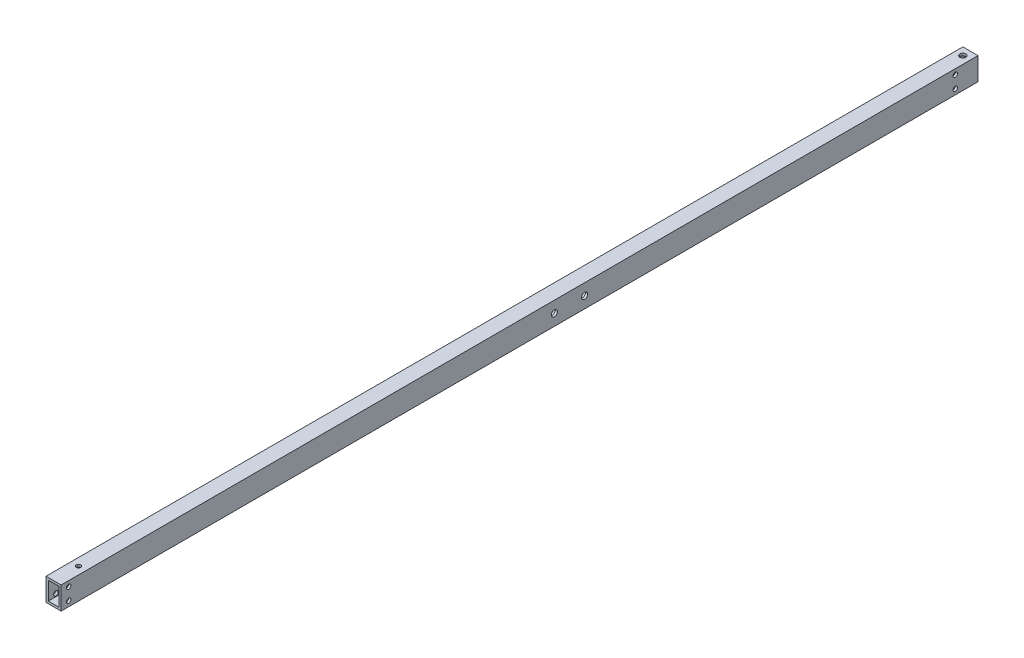
ISO-10303-21;
HEADER;
FILE_DESCRIPTION(('STEP AP214'),'2;1');
FILE_NAME('part.step','',(''),(''),'','','');
FILE_SCHEMA(('AUTOMOTIVE_DESIGN { 1 0 10303 214 1 1 1 1 }'));
ENDSEC;
DATA;
#1=APPLICATION_CONTEXT('core data for automotive mechanical design processes');
#2=APPLICATION_PROTOCOL_DEFINITION('international standard','automotive_design',2000,#1);
#3=PRODUCT_CONTEXT('',#1,'mechanical');
#4=PRODUCT('Part','Part','',(#3));
#5=PRODUCT_RELATED_PRODUCT_CATEGORY('part','',(#4));
#6=PRODUCT_DEFINITION_FORMATION('','',#4);
#7=PRODUCT_DEFINITION_CONTEXT('part definition',#1,'design');
#8=PRODUCT_DEFINITION('design','',#6,#7);
#9=PRODUCT_DEFINITION_SHAPE('','',#8);
#10=(LENGTH_UNIT() NAMED_UNIT(*) SI_UNIT(.MILLI.,.METRE.));
#11=(NAMED_UNIT(*) PLANE_ANGLE_UNIT() SI_UNIT($,.RADIAN.));
#12=(NAMED_UNIT(*) SI_UNIT($,.STERADIAN.) SOLID_ANGLE_UNIT());
#13=UNCERTAINTY_MEASURE_WITH_UNIT(LENGTH_MEASURE(1.E-05),#10,'distance_accuracy_value','');
#14=(GEOMETRIC_REPRESENTATION_CONTEXT(3) GLOBAL_UNCERTAINTY_ASSIGNED_CONTEXT((#13)) GLOBAL_UNIT_ASSIGNED_CONTEXT((#10,
#11,#12)) REPRESENTATION_CONTEXT('',''));
#15=CARTESIAN_POINT('',(0.,0.,0.));
#16=DIRECTION('',(0.,0.,1.));
#17=DIRECTION('',(1.,0.,0.));
#18=AXIS2_PLACEMENT_3D('',#15,#16,#17);
#19=CARTESIAN_POINT('',(0.,0.,606.));
#20=DIRECTION('',(0.,0.,1.));
#21=DIRECTION('',(1.,0.,0.));
#22=AXIS2_PLACEMENT_3D('',#19,#20,#21);
#23=PLANE('',#22);
#24=DIRECTION('',(0.,1.,0.));
#25=VECTOR('',#24,1.);
#26=CARTESIAN_POINT('',(5.,-7.5,606.));
#27=LINE('',#26,#25);
#28=CARTESIAN_POINT('',(5.,-7.5,606.));
#29=VERTEX_POINT('',#28);
#30=CARTESIAN_POINT('',(5.,7.5,606.));
#31=VERTEX_POINT('',#30);
#32=EDGE_CURVE('E164',#29,#31,#27,.T.);
#33=ORIENTED_EDGE('',*,*,#32,.T.);
#34=DIRECTION('',(-1.,0.,0.));
#35=VECTOR('',#34,1.);
#36=CARTESIAN_POINT('',(-5.,7.5,606.));
#37=LINE('',#36,#35);
#38=CARTESIAN_POINT('',(-5.,7.5,606.));
#39=VERTEX_POINT('',#38);
#40=EDGE_CURVE('E167',#31,#39,#37,.T.);
#41=ORIENTED_EDGE('',*,*,#40,.T.);
#42=DIRECTION('',(0.,-1.,0.));
#43=VECTOR('',#42,1.);
#44=CARTESIAN_POINT('',(-5.,-7.5,606.));
#45=LINE('',#44,#43);
#46=CARTESIAN_POINT('',(-5.,-7.5,606.));
#47=VERTEX_POINT('',#46);
#48=EDGE_CURVE('E170',#39,#47,#45,.T.);
#49=ORIENTED_EDGE('',*,*,#48,.T.);
#50=DIRECTION('',(1.,0.,0.));
#51=VECTOR('',#50,1.);
#52=CARTESIAN_POINT('',(-5.,-7.5,606.));
#53=LINE('',#52,#51);
#54=EDGE_CURVE('E172',#47,#29,#53,.T.);
#55=ORIENTED_EDGE('',*,*,#54,.T.);
#56=EDGE_LOOP('',(#33,#41,#49,#55));
#57=FACE_BOUND('',#56,.T.);
#58=DIRECTION('',(-1.,0.,0.));
#59=VECTOR('',#58,1.);
#60=CARTESIAN_POINT('',(0.,6.,606.));
#61=LINE('',#60,#59);
#62=CARTESIAN_POINT('',(3.5,6.,606.));
#63=VERTEX_POINT('',#62);
#64=CARTESIAN_POINT('',(-3.5,6.,606.));
#65=VERTEX_POINT('',#64);
#66=EDGE_CURVE('E134',#63,#65,#61,.T.);
#67=ORIENTED_EDGE('',*,*,#66,.F.);
#68=DIRECTION('',(0.,1.,0.));
#69=VECTOR('',#68,1.);
#70=CARTESIAN_POINT('',(3.5,0.,606.));
#71=LINE('',#70,#69);
#72=CARTESIAN_POINT('',(3.5,-6.,606.));
#73=VERTEX_POINT('',#72);
#74=EDGE_CURVE('E126',#73,#63,#71,.T.);
#75=ORIENTED_EDGE('',*,*,#74,.F.);
#76=DIRECTION('',(1.,0.,0.));
#77=VECTOR('',#76,1.);
#78=CARTESIAN_POINT('',(0.,-6.,606.));
#79=LINE('',#78,#77);
#80=CARTESIAN_POINT('',(-3.5,-6.,606.));
#81=VERTEX_POINT('',#80);
#82=EDGE_CURVE('E148',#81,#73,#79,.T.);
#83=ORIENTED_EDGE('',*,*,#82,.F.);
#84=DIRECTION('',(0.,-1.,0.));
#85=VECTOR('',#84,1.);
#86=CARTESIAN_POINT('',(-3.5,0.,606.));
#87=LINE('',#86,#85);
#88=EDGE_CURVE('E146',#65,#81,#87,.T.);
#89=ORIENTED_EDGE('',*,*,#88,.F.);
#90=EDGE_LOOP('',(#67,#75,#83,#89));
#91=FACE_BOUND('',#90,.T.);
#92=ADVANCED_FACE('F59',(#57,#91),#23,.T.);
#93=CARTESIAN_POINT('',(0.,0.,0.));
#94=DIRECTION('',(0.,0.,1.));
#95=DIRECTION('',(1.,0.,0.));
#96=AXIS2_PLACEMENT_3D('',#93,#94,#95);
#97=PLANE('',#96);
#98=DIRECTION('',(0.,1.,0.));
#99=VECTOR('',#98,1.);
#100=CARTESIAN_POINT('',(5.,-7.5,0.));
#101=LINE('',#100,#99);
#102=CARTESIAN_POINT('',(5.,-7.5,0.));
#103=VERTEX_POINT('',#102);
#104=CARTESIAN_POINT('',(5.,7.5,0.));
#105=VERTEX_POINT('',#104);
#106=EDGE_CURVE('E142',#103,#105,#101,.T.);
#107=ORIENTED_EDGE('',*,*,#106,.F.);
#108=DIRECTION('',(1.,0.,0.));
#109=VECTOR('',#108,1.);
#110=CARTESIAN_POINT('',(-5.,-7.5,0.));
#111=LINE('',#110,#109);
#112=CARTESIAN_POINT('',(-5.,-7.5,0.));
#113=VERTEX_POINT('',#112);
#114=EDGE_CURVE('E168',#113,#103,#111,.T.);
#115=ORIENTED_EDGE('',*,*,#114,.F.);
#116=DIRECTION('',(0.,-1.,0.));
#117=VECTOR('',#116,1.);
#118=CARTESIAN_POINT('',(-5.,-7.5,0.));
#119=LINE('',#118,#117);
#120=CARTESIAN_POINT('',(-5.,7.5,0.));
#121=VERTEX_POINT('',#120);
#122=EDGE_CURVE('E179',#121,#113,#119,.T.);
#123=ORIENTED_EDGE('',*,*,#122,.F.);
#124=DIRECTION('',(-1.,0.,0.));
#125=VECTOR('',#124,1.);
#126=CARTESIAN_POINT('',(-5.,7.5,0.));
#127=LINE('',#126,#125);
#128=EDGE_CURVE('E177',#105,#121,#127,.T.);
#129=ORIENTED_EDGE('',*,*,#128,.F.);
#130=EDGE_LOOP('',(#107,#115,#123,#129));
#131=FACE_BOUND('',#130,.T.);
#132=DIRECTION('',(0.,1.,0.));
#133=VECTOR('',#132,1.);
#134=CARTESIAN_POINT('',(3.5,0.,0.));
#135=LINE('',#134,#133);
#136=CARTESIAN_POINT('',(3.5,-6.,0.));
#137=VERTEX_POINT('',#136);
#138=CARTESIAN_POINT('',(3.5,6.,0.));
#139=VERTEX_POINT('',#138);
#140=EDGE_CURVE('E84',#137,#139,#135,.T.);
#141=ORIENTED_EDGE('',*,*,#140,.T.);
#142=DIRECTION('',(-1.,0.,0.));
#143=VECTOR('',#142,1.);
#144=CARTESIAN_POINT('',(0.,6.,0.));
#145=LINE('',#144,#143);
#146=CARTESIAN_POINT('',(-3.5,6.,0.));
#147=VERTEX_POINT('',#146);
#148=EDGE_CURVE('E141',#139,#147,#145,.T.);
#149=ORIENTED_EDGE('',*,*,#148,.T.);
#150=DIRECTION('',(0.,-1.,0.));
#151=VECTOR('',#150,1.);
#152=CARTESIAN_POINT('',(-3.5,0.,0.));
#153=LINE('',#152,#151);
#154=CARTESIAN_POINT('',(-3.5,-6.,0.));
#155=VERTEX_POINT('',#154);
#156=EDGE_CURVE('E156',#147,#155,#153,.T.);
#157=ORIENTED_EDGE('',*,*,#156,.T.);
#158=DIRECTION('',(1.,0.,0.));
#159=VECTOR('',#158,1.);
#160=CARTESIAN_POINT('',(0.,-6.,0.));
#161=LINE('',#160,#159);
#162=EDGE_CURVE('E135',#155,#137,#161,.T.);
#163=ORIENTED_EDGE('',*,*,#162,.T.);
#164=EDGE_LOOP('',(#141,#149,#157,#163));
#165=FACE_BOUND('',#164,.T.);
#166=ADVANCED_FACE('F313',(#131,#165),#97,.F.);
#167=CARTESIAN_POINT('',(5.,-7.5,606.));
#168=DIRECTION('',(-1.,0.,0.));
#169=DIRECTION('',(0.,0.,1.));
#170=AXIS2_PLACEMENT_3D('',#167,#168,#169);
#171=PLANE('',#170);
#172=CARTESIAN_POINT('',(5.,4.,15.));
#173=DIRECTION('',(1.,0.,0.));
#174=DIRECTION('',(0.,0.,-1.));
#175=AXIS2_PLACEMENT_3D('',#172,#173,#174);
#176=CIRCLE('',#175,1.5);
#177=CARTESIAN_POINT('',(5.,4.,13.5));
#178=VERTEX_POINT('',#177);
#179=EDGE_CURVE('E248',#178,#178,#176,.T.);
#180=ORIENTED_EDGE('',*,*,#179,.F.);
#181=EDGE_LOOP('',(#180));
#182=FACE_BOUND('',#181,.T.);
#183=CARTESIAN_POINT('',(5.,-4.,15.));
#184=DIRECTION('',(1.,0.,0.));
#185=DIRECTION('',(0.,0.,1.));
#186=AXIS2_PLACEMENT_3D('',#183,#184,#185);
#187=CIRCLE('',#186,1.5);
#188=CARTESIAN_POINT('',(5.,-4.,16.5));
#189=VERTEX_POINT('',#188);
#190=EDGE_CURVE('E254',#189,#189,#187,.T.);
#191=ORIENTED_EDGE('',*,*,#190,.F.);
#192=EDGE_LOOP('',(#191));
#193=FACE_BOUND('',#192,.T.);
#194=CARTESIAN_POINT('',(5.,0.,280.));
#195=DIRECTION('',(1.,0.,0.));
#196=DIRECTION('',(0.,0.,-1.));
#197=AXIS2_PLACEMENT_3D('',#194,#195,#196);
#198=CIRCLE('',#197,2.);
#199=CARTESIAN_POINT('',(5.,0.,278.));
#200=VERTEX_POINT('',#199);
#201=EDGE_CURVE('E260',#200,#200,#198,.T.);
#202=ORIENTED_EDGE('',*,*,#201,.F.);
#203=EDGE_LOOP('',(#202));
#204=FACE_BOUND('',#203,.T.);
#205=CARTESIAN_POINT('',(5.,-4.,601.));
#206=DIRECTION('',(1.,0.,0.));
#207=DIRECTION('',(0.,0.,1.));
#208=AXIS2_PLACEMENT_3D('',#205,#206,#207);
#209=CIRCLE('',#208,1.49999999999997);
#210=CARTESIAN_POINT('',(5.,-4.,602.5));
#211=VERTEX_POINT('',#210);
#212=EDGE_CURVE('E241',#211,#211,#209,.T.);
#213=ORIENTED_EDGE('',*,*,#212,.F.);
#214=EDGE_LOOP('',(#213));
#215=FACE_BOUND('',#214,.T.);
#216=CARTESIAN_POINT('',(5.,0.,260.));
#217=DIRECTION('',(1.,0.,0.));
#218=DIRECTION('',(0.,0.,-1.));
#219=AXIS2_PLACEMENT_3D('',#216,#217,#218);
#220=CIRCLE('',#219,2.);
#221=CARTESIAN_POINT('',(5.,0.,258.));
#222=VERTEX_POINT('',#221);
#223=EDGE_CURVE('E237',#222,#222,#220,.T.);
#224=ORIENTED_EDGE('',*,*,#223,.F.);
#225=EDGE_LOOP('',(#224));
#226=FACE_BOUND('',#225,.T.);
#227=CARTESIAN_POINT('',(5.,4.,601.));
#228=DIRECTION('',(1.,0.,0.));
#229=DIRECTION('',(0.,0.,-1.));
#230=AXIS2_PLACEMENT_3D('',#227,#228,#229);
#231=CIRCLE('',#230,1.49999999999997);
#232=CARTESIAN_POINT('',(5.,4.,599.5));
#233=VERTEX_POINT('',#232);
#234=EDGE_CURVE('E247',#233,#233,#231,.T.);
#235=ORIENTED_EDGE('',*,*,#234,.F.);
#236=EDGE_LOOP('',(#235));
#237=FACE_BOUND('',#236,.T.);
#238=ORIENTED_EDGE('',*,*,#106,.T.);
#239=DIRECTION('',(0.,0.,-1.));
#240=VECTOR('',#239,1.);
#241=CARTESIAN_POINT('',(5.,7.5,606.));
#242=LINE('',#241,#240);
#243=EDGE_CURVE('E12',#31,#105,#242,.T.);
#244=ORIENTED_EDGE('',*,*,#243,.F.);
#245=ORIENTED_EDGE('',*,*,#32,.F.);
#246=DIRECTION('',(0.,0.,-1.));
#247=VECTOR('',#246,1.);
#248=CARTESIAN_POINT('',(5.,-7.5,606.));
#249=LINE('',#248,#247);
#250=EDGE_CURVE('E174',#29,#103,#249,.T.);
#251=ORIENTED_EDGE('',*,*,#250,.T.);
#252=EDGE_LOOP('',(#238,#244,#245,#251));
#253=FACE_BOUND('',#252,.T.);
#254=ADVANCED_FACE('F61',(#182,#193,#204,#215,#226,#237,#253),#171,.F.);
#255=CARTESIAN_POINT('',(-5.,7.5,606.));
#256=DIRECTION('',(0.,-1.,0.));
#257=DIRECTION('',(0.,0.,-1.));
#258=AXIS2_PLACEMENT_3D('',#255,#256,#257);
#259=PLANE('',#258);
#260=CARTESIAN_POINT('',(0.,7.5,5.));
#261=DIRECTION('',(0.,1.,0.));
#262=DIRECTION('',(0.,0.,1.));
#263=AXIS2_PLACEMENT_3D('',#260,#261,#262);
#264=CIRCLE('',#263,2.);
#265=CARTESIAN_POINT('',(0.,7.5,7.));
#266=VERTEX_POINT('',#265);
#267=EDGE_CURVE('E221',#266,#266,#264,.T.);
#268=ORIENTED_EDGE('',*,*,#267,.F.);
#269=EDGE_LOOP('',(#268));
#270=FACE_BOUND('',#269,.T.);
#271=CARTESIAN_POINT('',(0.,7.5,589.5));
#272=DIRECTION('',(0.,1.,0.));
#273=DIRECTION('',(0.,0.,1.));
#274=AXIS2_PLACEMENT_3D('',#271,#272,#273);
#275=CIRCLE('',#274,1.5);
#276=CARTESIAN_POINT('',(0.,7.5,591.));
#277=VERTEX_POINT('',#276);
#278=EDGE_CURVE('E231',#277,#277,#275,.T.);
#279=ORIENTED_EDGE('',*,*,#278,.F.);
#280=EDGE_LOOP('',(#279));
#281=FACE_BOUND('',#280,.T.);
#282=ORIENTED_EDGE('',*,*,#128,.T.);
#283=DIRECTION('',(0.,0.,-1.));
#284=VECTOR('',#283,1.);
#285=CARTESIAN_POINT('',(-5.,7.5,606.));
#286=LINE('',#285,#284);
#287=EDGE_CURVE('E68',#39,#121,#286,.T.);
#288=ORIENTED_EDGE('',*,*,#287,.F.);
#289=ORIENTED_EDGE('',*,*,#40,.F.);
#290=ORIENTED_EDGE('',*,*,#243,.T.);
#291=EDGE_LOOP('',(#282,#288,#289,#290));
#292=FACE_BOUND('',#291,.T.);
#293=ADVANCED_FACE('F312',(#270,#281,#292),#259,.F.);
#294=CARTESIAN_POINT('',(-5.,-7.5,606.));
#295=DIRECTION('',(1.,0.,0.));
#296=DIRECTION('',(0.,0.,-1.));
#297=AXIS2_PLACEMENT_3D('',#294,#295,#296);
#298=PLANE('',#297);
#299=CARTESIAN_POINT('',(-5.,4.,15.));
#300=DIRECTION('',(1.,0.,0.));
#301=DIRECTION('',(0.,0.,-1.));
#302=AXIS2_PLACEMENT_3D('',#299,#300,#301);
#303=CIRCLE('',#302,1.5);
#304=CARTESIAN_POINT('',(-5.,4.,13.5));
#305=VERTEX_POINT('',#304);
#306=EDGE_CURVE('E244',#305,#305,#303,.T.);
#307=ORIENTED_EDGE('',*,*,#306,.T.);
#308=EDGE_LOOP('',(#307));
#309=FACE_BOUND('',#308,.T.);
#310=CARTESIAN_POINT('',(-5.,-4.,15.));
#311=DIRECTION('',(1.,0.,0.));
#312=DIRECTION('',(0.,0.,1.));
#313=AXIS2_PLACEMENT_3D('',#310,#311,#312);
#314=CIRCLE('',#313,1.5);
#315=CARTESIAN_POINT('',(-5.,-4.,16.5));
#316=VERTEX_POINT('',#315);
#317=EDGE_CURVE('E251',#316,#316,#314,.T.);
#318=ORIENTED_EDGE('',*,*,#317,.T.);
#319=EDGE_LOOP('',(#318));
#320=FACE_BOUND('',#319,.T.);
#321=CARTESIAN_POINT('',(-5.,0.,280.));
#322=DIRECTION('',(1.,0.,0.));
#323=DIRECTION('',(0.,0.,-1.));
#324=AXIS2_PLACEMENT_3D('',#321,#322,#323);
#325=CIRCLE('',#324,2.);
#326=CARTESIAN_POINT('',(-5.,0.,278.));
#327=VERTEX_POINT('',#326);
#328=EDGE_CURVE('E257',#327,#327,#325,.T.);
#329=ORIENTED_EDGE('',*,*,#328,.T.);
#330=EDGE_LOOP('',(#329));
#331=FACE_BOUND('',#330,.T.);
#332=CARTESIAN_POINT('',(-5.,-4.,601.));
#333=DIRECTION('',(1.,0.,0.));
#334=DIRECTION('',(0.,0.,1.));
#335=AXIS2_PLACEMENT_3D('',#332,#333,#334);
#336=CIRCLE('',#335,1.49999999999997);
#337=CARTESIAN_POINT('',(-5.,-4.,602.5));
#338=VERTEX_POINT('',#337);
#339=EDGE_CURVE('E263',#338,#338,#336,.T.);
#340=ORIENTED_EDGE('',*,*,#339,.T.);
#341=EDGE_LOOP('',(#340));
#342=FACE_BOUND('',#341,.T.);
#343=CARTESIAN_POINT('',(-5.,0.,260.));
#344=DIRECTION('',(1.,0.,0.));
#345=DIRECTION('',(0.,0.,-1.));
#346=AXIS2_PLACEMENT_3D('',#343,#344,#345);
#347=CIRCLE('',#346,2.);
#348=CARTESIAN_POINT('',(-5.,0.,258.));
#349=VERTEX_POINT('',#348);
#350=EDGE_CURVE('E238',#349,#349,#347,.T.);
#351=ORIENTED_EDGE('',*,*,#350,.T.);
#352=EDGE_LOOP('',(#351));
#353=FACE_BOUND('',#352,.T.);
#354=CARTESIAN_POINT('',(-5.,4.,601.));
#355=DIRECTION('',(1.,0.,0.));
#356=DIRECTION('',(0.,0.,-1.));
#357=AXIS2_PLACEMENT_3D('',#354,#355,#356);
#358=CIRCLE('',#357,1.49999999999997);
#359=CARTESIAN_POINT('',(-5.,4.,599.5));
#360=VERTEX_POINT('',#359);
#361=EDGE_CURVE('E193',#360,#360,#358,.T.);
#362=ORIENTED_EDGE('',*,*,#361,.T.);
#363=EDGE_LOOP('',(#362));
#364=FACE_BOUND('',#363,.T.);
#365=ORIENTED_EDGE('',*,*,#122,.T.);
#366=DIRECTION('',(0.,0.,-1.));
#367=VECTOR('',#366,1.);
#368=CARTESIAN_POINT('',(-5.,-7.5,606.));
#369=LINE('',#368,#367);
#370=EDGE_CURVE('E184',#47,#113,#369,.T.);
#371=ORIENTED_EDGE('',*,*,#370,.F.);
#372=ORIENTED_EDGE('',*,*,#48,.F.);
#373=ORIENTED_EDGE('',*,*,#287,.T.);
#374=EDGE_LOOP('',(#365,#371,#372,#373));
#375=FACE_BOUND('',#374,.T.);
#376=ADVANCED_FACE('F331',(#309,#320,#331,#342,#353,#364,#375),#298,.F.);
#377=CARTESIAN_POINT('',(-5.,-7.5,606.));
#378=DIRECTION('',(0.,1.,0.));
#379=DIRECTION('',(0.,0.,1.));
#380=AXIS2_PLACEMENT_3D('',#377,#378,#379);
#381=PLANE('',#380);
#382=CARTESIAN_POINT('',(0.,-7.5,5.));
#383=DIRECTION('',(0.,1.,0.));
#384=DIRECTION('',(0.,0.,1.));
#385=AXIS2_PLACEMENT_3D('',#382,#383,#384);
#386=CIRCLE('',#385,2.);
#387=CARTESIAN_POINT('',(0.,-7.5,7.));
#388=VERTEX_POINT('',#387);
#389=EDGE_CURVE('E215',#388,#388,#386,.T.);
#390=ORIENTED_EDGE('',*,*,#389,.T.);
#391=EDGE_LOOP('',(#390));
#392=FACE_BOUND('',#391,.T.);
#393=CARTESIAN_POINT('',(0.,-7.5,589.5));
#394=DIRECTION('',(0.,1.,0.));
#395=DIRECTION('',(0.,0.,1.));
#396=AXIS2_PLACEMENT_3D('',#393,#394,#395);
#397=CIRCLE('',#396,1.5);
#398=CARTESIAN_POINT('',(0.,-7.5,591.));
#399=VERTEX_POINT('',#398);
#400=EDGE_CURVE('E226',#399,#399,#397,.T.);
#401=ORIENTED_EDGE('',*,*,#400,.T.);
#402=EDGE_LOOP('',(#401));
#403=FACE_BOUND('',#402,.T.);
#404=ORIENTED_EDGE('',*,*,#114,.T.);
#405=ORIENTED_EDGE('',*,*,#250,.F.);
#406=ORIENTED_EDGE('',*,*,#54,.F.);
#407=ORIENTED_EDGE('',*,*,#370,.T.);
#408=EDGE_LOOP('',(#404,#405,#406,#407));
#409=FACE_BOUND('',#408,.T.);
#410=ADVANCED_FACE('F289',(#392,#403,#409),#381,.F.);
#411=CARTESIAN_POINT('',(3.5,0.,606.));
#412=DIRECTION('',(-1.,0.,0.));
#413=DIRECTION('',(0.,0.,1.));
#414=AXIS2_PLACEMENT_3D('',#411,#412,#413);
#415=PLANE('',#414);
#416=CARTESIAN_POINT('',(3.5,4.,15.));
#417=DIRECTION('',(-1.,0.,0.));
#418=DIRECTION('',(0.,0.,1.));
#419=AXIS2_PLACEMENT_3D('',#416,#417,#418);
#420=CIRCLE('',#419,1.5);
#421=CARTESIAN_POINT('',(3.5,4.,16.5));
#422=VERTEX_POINT('',#421);
#423=EDGE_CURVE('E154',#422,#422,#420,.T.);
#424=ORIENTED_EDGE('',*,*,#423,.F.);
#425=EDGE_LOOP('',(#424));
#426=FACE_BOUND('',#425,.T.);
#427=CARTESIAN_POINT('',(3.5,-4.,15.));
#428=DIRECTION('',(-1.,0.,0.));
#429=DIRECTION('',(0.,0.,1.));
#430=AXIS2_PLACEMENT_3D('',#427,#428,#429);
#431=CIRCLE('',#430,1.5);
#432=CARTESIAN_POINT('',(3.5,-4.,16.5));
#433=VERTEX_POINT('',#432);
#434=EDGE_CURVE('E209',#433,#433,#431,.T.);
#435=ORIENTED_EDGE('',*,*,#434,.F.);
#436=EDGE_LOOP('',(#435));
#437=FACE_BOUND('',#436,.T.);
#438=CARTESIAN_POINT('',(3.5,0.,280.));
#439=DIRECTION('',(-1.,0.,0.));
#440=DIRECTION('',(0.,0.,1.));
#441=AXIS2_PLACEMENT_3D('',#438,#439,#440);
#442=CIRCLE('',#441,2.);
#443=CARTESIAN_POINT('',(3.5,0.,282.));
#444=VERTEX_POINT('',#443);
#445=EDGE_CURVE('E205',#444,#444,#442,.T.);
#446=ORIENTED_EDGE('',*,*,#445,.F.);
#447=EDGE_LOOP('',(#446));
#448=FACE_BOUND('',#447,.T.);
#449=CARTESIAN_POINT('',(3.5,-4.,601.));
#450=DIRECTION('',(-1.,0.,0.));
#451=DIRECTION('',(0.,0.,1.));
#452=AXIS2_PLACEMENT_3D('',#449,#450,#451);
#453=CIRCLE('',#452,1.49999999999997);
#454=CARTESIAN_POINT('',(3.5,-4.,602.5));
#455=VERTEX_POINT('',#454);
#456=EDGE_CURVE('E201',#455,#455,#453,.T.);
#457=ORIENTED_EDGE('',*,*,#456,.F.);
#458=EDGE_LOOP('',(#457));
#459=FACE_BOUND('',#458,.T.);
#460=CARTESIAN_POINT('',(3.5,0.,260.));
#461=DIRECTION('',(-1.,0.,0.));
#462=DIRECTION('',(0.,0.,1.));
#463=AXIS2_PLACEMENT_3D('',#460,#461,#462);
#464=CIRCLE('',#463,2.);
#465=CARTESIAN_POINT('',(3.5,0.,262.));
#466=VERTEX_POINT('',#465);
#467=EDGE_CURVE('E197',#466,#466,#464,.T.);
#468=ORIENTED_EDGE('',*,*,#467,.F.);
#469=EDGE_LOOP('',(#468));
#470=FACE_BOUND('',#469,.T.);
#471=CARTESIAN_POINT('',(3.5,4.,601.));
#472=DIRECTION('',(-1.,0.,0.));
#473=DIRECTION('',(0.,0.,1.));
#474=AXIS2_PLACEMENT_3D('',#471,#472,#473);
#475=CIRCLE('',#474,1.49999999999997);
#476=CARTESIAN_POINT('',(3.5,4.,602.5));
#477=VERTEX_POINT('',#476);
#478=EDGE_CURVE('E192',#477,#477,#475,.T.);
#479=ORIENTED_EDGE('',*,*,#478,.F.);
#480=EDGE_LOOP('',(#479));
#481=FACE_BOUND('',#480,.T.);
#482=ORIENTED_EDGE('',*,*,#140,.F.);
#483=DIRECTION('',(0.,0.,-1.));
#484=VECTOR('',#483,1.);
#485=CARTESIAN_POINT('',(3.5,-6.,606.));
#486=LINE('',#485,#484);
#487=EDGE_CURVE('E130',#73,#137,#486,.T.);
#488=ORIENTED_EDGE('',*,*,#487,.F.);
#489=ORIENTED_EDGE('',*,*,#74,.T.);
#490=DIRECTION('',(0.,0.,-1.));
#491=VECTOR('',#490,1.);
#492=CARTESIAN_POINT('',(3.5,6.,606.));
#493=LINE('',#492,#491);
#494=EDGE_CURVE('E129',#63,#139,#493,.T.);
#495=ORIENTED_EDGE('',*,*,#494,.T.);
#496=EDGE_LOOP('',(#482,#488,#489,#495));
#497=FACE_BOUND('',#496,.T.);
#498=ADVANCED_FACE('F128',(#426,#437,#448,#459,#470,#481,#497),#415,.T.);
#499=CARTESIAN_POINT('',(0.,6.,606.));
#500=DIRECTION('',(0.,-1.,0.));
#501=DIRECTION('',(0.,0.,-1.));
#502=AXIS2_PLACEMENT_3D('',#499,#500,#501);
#503=PLANE('',#502);
#504=CARTESIAN_POINT('',(0.,6.,5.));
#505=DIRECTION('',(0.,-1.,0.));
#506=DIRECTION('',(0.,0.,-1.));
#507=AXIS2_PLACEMENT_3D('',#504,#505,#506);
#508=CIRCLE('',#507,2.);
#509=CARTESIAN_POINT('',(0.,6.,3.));
#510=VERTEX_POINT('',#509);
#511=EDGE_CURVE('E234',#510,#510,#508,.T.);
#512=ORIENTED_EDGE('',*,*,#511,.F.);
#513=EDGE_LOOP('',(#512));
#514=FACE_BOUND('',#513,.T.);
#515=CARTESIAN_POINT('',(0.,6.,589.5));
#516=DIRECTION('',(0.,-1.,0.));
#517=DIRECTION('',(0.,0.,-1.));
#518=AXIS2_PLACEMENT_3D('',#515,#516,#517);
#519=CIRCLE('',#518,1.5);
#520=CARTESIAN_POINT('',(0.,6.,588.));
#521=VERTEX_POINT('',#520);
#522=EDGE_CURVE('E214',#521,#521,#519,.T.);
#523=ORIENTED_EDGE('',*,*,#522,.F.);
#524=EDGE_LOOP('',(#523));
#525=FACE_BOUND('',#524,.T.);
#526=ORIENTED_EDGE('',*,*,#148,.F.);
#527=ORIENTED_EDGE('',*,*,#494,.F.);
#528=ORIENTED_EDGE('',*,*,#66,.T.);
#529=DIRECTION('',(0.,0.,-1.));
#530=VECTOR('',#529,1.);
#531=CARTESIAN_POINT('',(-3.5,6.,606.));
#532=LINE('',#531,#530);
#533=EDGE_CURVE('E143',#65,#147,#532,.T.);
#534=ORIENTED_EDGE('',*,*,#533,.T.);
#535=EDGE_LOOP('',(#526,#527,#528,#534));
#536=FACE_BOUND('',#535,.T.);
#537=ADVANCED_FACE('F138',(#514,#525,#536),#503,.T.);
#538=CARTESIAN_POINT('',(-3.5,0.,606.));
#539=DIRECTION('',(1.,0.,0.));
#540=DIRECTION('',(0.,0.,-1.));
#541=AXIS2_PLACEMENT_3D('',#538,#539,#540);
#542=PLANE('',#541);
#543=CARTESIAN_POINT('',(-3.5,4.,15.));
#544=DIRECTION('',(1.,0.,0.));
#545=DIRECTION('',(0.,0.,-1.));
#546=AXIS2_PLACEMENT_3D('',#543,#544,#545);
#547=CIRCLE('',#546,1.5);
#548=CARTESIAN_POINT('',(-3.5,4.,13.5));
#549=VERTEX_POINT('',#548);
#550=EDGE_CURVE('E210',#549,#549,#547,.T.);
#551=ORIENTED_EDGE('',*,*,#550,.F.);
#552=EDGE_LOOP('',(#551));
#553=FACE_BOUND('',#552,.T.);
#554=CARTESIAN_POINT('',(-3.5,-4.,15.));
#555=DIRECTION('',(1.,0.,0.));
#556=DIRECTION('',(0.,0.,-1.));
#557=AXIS2_PLACEMENT_3D('',#554,#555,#556);
#558=CIRCLE('',#557,1.5);
#559=CARTESIAN_POINT('',(-3.5,-4.,13.5));
#560=VERTEX_POINT('',#559);
#561=EDGE_CURVE('E206',#560,#560,#558,.T.);
#562=ORIENTED_EDGE('',*,*,#561,.F.);
#563=EDGE_LOOP('',(#562));
#564=FACE_BOUND('',#563,.T.);
#565=CARTESIAN_POINT('',(-3.5,0.,280.));
#566=DIRECTION('',(1.,0.,0.));
#567=DIRECTION('',(0.,0.,-1.));
#568=AXIS2_PLACEMENT_3D('',#565,#566,#567);
#569=CIRCLE('',#568,2.);
#570=CARTESIAN_POINT('',(-3.5,0.,278.));
#571=VERTEX_POINT('',#570);
#572=EDGE_CURVE('E202',#571,#571,#569,.T.);
#573=ORIENTED_EDGE('',*,*,#572,.F.);
#574=EDGE_LOOP('',(#573));
#575=FACE_BOUND('',#574,.T.);
#576=CARTESIAN_POINT('',(-3.5,-4.,601.));
#577=DIRECTION('',(1.,0.,0.));
#578=DIRECTION('',(0.,0.,-1.));
#579=AXIS2_PLACEMENT_3D('',#576,#577,#578);
#580=CIRCLE('',#579,1.49999999999997);
#581=CARTESIAN_POINT('',(-3.5,-4.,599.5));
#582=VERTEX_POINT('',#581);
#583=EDGE_CURVE('E198',#582,#582,#580,.T.);
#584=ORIENTED_EDGE('',*,*,#583,.F.);
#585=EDGE_LOOP('',(#584));
#586=FACE_BOUND('',#585,.T.);
#587=CARTESIAN_POINT('',(-3.5,0.,260.));
#588=DIRECTION('',(1.,0.,0.));
#589=DIRECTION('',(0.,0.,-1.));
#590=AXIS2_PLACEMENT_3D('',#587,#588,#589);
#591=CIRCLE('',#590,2.);
#592=CARTESIAN_POINT('',(-3.5,0.,258.));
#593=VERTEX_POINT('',#592);
#594=EDGE_CURVE('E194',#593,#593,#591,.T.);
#595=ORIENTED_EDGE('',*,*,#594,.F.);
#596=EDGE_LOOP('',(#595));
#597=FACE_BOUND('',#596,.T.);
#598=CARTESIAN_POINT('',(-3.5,4.,601.));
#599=DIRECTION('',(1.,0.,0.));
#600=DIRECTION('',(0.,0.,-1.));
#601=AXIS2_PLACEMENT_3D('',#598,#599,#600);
#602=CIRCLE('',#601,1.49999999999997);
#603=CARTESIAN_POINT('',(-3.5,4.,599.5));
#604=VERTEX_POINT('',#603);
#605=EDGE_CURVE('E189',#604,#604,#602,.T.);
#606=ORIENTED_EDGE('',*,*,#605,.F.);
#607=EDGE_LOOP('',(#606));
#608=FACE_BOUND('',#607,.T.);
#609=ORIENTED_EDGE('',*,*,#156,.F.);
#610=ORIENTED_EDGE('',*,*,#533,.F.);
#611=ORIENTED_EDGE('',*,*,#88,.T.);
#612=DIRECTION('',(0.,0.,-1.));
#613=VECTOR('',#612,1.);
#614=CARTESIAN_POINT('',(-3.5,-6.,606.));
#615=LINE('',#614,#613);
#616=EDGE_CURVE('E76',#81,#155,#615,.T.);
#617=ORIENTED_EDGE('',*,*,#616,.T.);
#618=EDGE_LOOP('',(#609,#610,#611,#617));
#619=FACE_BOUND('',#618,.T.);
#620=ADVANCED_FACE('F351',(#553,#564,#575,#586,#597,#608,#619),#542,.T.);
#621=CARTESIAN_POINT('',(0.,-6.,606.));
#622=DIRECTION('',(0.,1.,0.));
#623=DIRECTION('',(0.,0.,1.));
#624=AXIS2_PLACEMENT_3D('',#621,#622,#623);
#625=PLANE('',#624);
#626=CARTESIAN_POINT('',(0.,-6.,5.));
#627=DIRECTION('',(0.,1.,0.));
#628=DIRECTION('',(0.,0.,1.));
#629=AXIS2_PLACEMENT_3D('',#626,#627,#628);
#630=CIRCLE('',#629,2.);
#631=CARTESIAN_POINT('',(0.,-6.,7.));
#632=VERTEX_POINT('',#631);
#633=EDGE_CURVE('E63',#632,#632,#630,.T.);
#634=ORIENTED_EDGE('',*,*,#633,.F.);
#635=EDGE_LOOP('',(#634));
#636=FACE_BOUND('',#635,.T.);
#637=CARTESIAN_POINT('',(0.,-6.,589.5));
#638=DIRECTION('',(0.,1.,0.));
#639=DIRECTION('',(0.,0.,1.));
#640=AXIS2_PLACEMENT_3D('',#637,#638,#639);
#641=CIRCLE('',#640,1.5);
#642=CARTESIAN_POINT('',(0.,-6.,591.));
#643=VERTEX_POINT('',#642);
#644=EDGE_CURVE('E212',#643,#643,#641,.T.);
#645=ORIENTED_EDGE('',*,*,#644,.F.);
#646=EDGE_LOOP('',(#645));
#647=FACE_BOUND('',#646,.T.);
#648=ORIENTED_EDGE('',*,*,#162,.F.);
#649=ORIENTED_EDGE('',*,*,#616,.F.);
#650=ORIENTED_EDGE('',*,*,#82,.T.);
#651=ORIENTED_EDGE('',*,*,#487,.T.);
#652=EDGE_LOOP('',(#648,#649,#650,#651));
#653=FACE_BOUND('',#652,.T.);
#654=ADVANCED_FACE('F355',(#636,#647,#653),#625,.T.);
#655=CARTESIAN_POINT('',(-5.,4.,601.));
#656=DIRECTION('',(1.,0.,0.));
#657=DIRECTION('',(0.,0.,-1.));
#658=AXIS2_PLACEMENT_3D('',#655,#656,#657);
#659=CYLINDRICAL_SURFACE('',#658,1.49999999999997);
#660=ORIENTED_EDGE('',*,*,#605,.T.);
#661=EDGE_LOOP('',(#660));
#662=FACE_BOUND('',#661,.T.);
#663=ORIENTED_EDGE('',*,*,#361,.F.);
#664=EDGE_LOOP('',(#663));
#665=FACE_BOUND('',#664,.T.);
#666=ADVANCED_FACE('F307',(#662,#665),#659,.F.);
#667=CARTESIAN_POINT('',(-5.,0.,260.));
#668=DIRECTION('',(1.,0.,0.));
#669=DIRECTION('',(0.,0.,-1.));
#670=AXIS2_PLACEMENT_3D('',#667,#668,#669);
#671=CYLINDRICAL_SURFACE('',#670,2.);
#672=ORIENTED_EDGE('',*,*,#594,.T.);
#673=EDGE_LOOP('',(#672));
#674=FACE_BOUND('',#673,.T.);
#675=ORIENTED_EDGE('',*,*,#350,.F.);
#676=EDGE_LOOP('',(#675));
#677=FACE_BOUND('',#676,.T.);
#678=ADVANCED_FACE('F361',(#674,#677),#671,.F.);
#679=CARTESIAN_POINT('',(-5.,-4.,601.));
#680=DIRECTION('',(1.,0.,0.));
#681=DIRECTION('',(0.,0.,-1.));
#682=AXIS2_PLACEMENT_3D('',#679,#680,#681);
#683=CYLINDRICAL_SURFACE('',#682,1.49999999999997);
#684=ORIENTED_EDGE('',*,*,#583,.T.);
#685=EDGE_LOOP('',(#684));
#686=FACE_BOUND('',#685,.T.);
#687=ORIENTED_EDGE('',*,*,#339,.F.);
#688=EDGE_LOOP('',(#687));
#689=FACE_BOUND('',#688,.T.);
#690=ADVANCED_FACE('F363',(#686,#689),#683,.F.);
#691=CARTESIAN_POINT('',(-5.,0.,280.));
#692=DIRECTION('',(1.,0.,0.));
#693=DIRECTION('',(0.,0.,-1.));
#694=AXIS2_PLACEMENT_3D('',#691,#692,#693);
#695=CYLINDRICAL_SURFACE('',#694,2.);
#696=ORIENTED_EDGE('',*,*,#572,.T.);
#697=EDGE_LOOP('',(#696));
#698=FACE_BOUND('',#697,.T.);
#699=ORIENTED_EDGE('',*,*,#328,.F.);
#700=EDGE_LOOP('',(#699));
#701=FACE_BOUND('',#700,.T.);
#702=ADVANCED_FACE('F366',(#698,#701),#695,.F.);
#703=CARTESIAN_POINT('',(-5.,-4.,15.));
#704=DIRECTION('',(1.,0.,0.));
#705=DIRECTION('',(0.,0.,-1.));
#706=AXIS2_PLACEMENT_3D('',#703,#704,#705);
#707=CYLINDRICAL_SURFACE('',#706,1.5);
#708=ORIENTED_EDGE('',*,*,#561,.T.);
#709=EDGE_LOOP('',(#708));
#710=FACE_BOUND('',#709,.T.);
#711=ORIENTED_EDGE('',*,*,#317,.F.);
#712=EDGE_LOOP('',(#711));
#713=FACE_BOUND('',#712,.T.);
#714=ADVANCED_FACE('F371',(#710,#713),#707,.F.);
#715=CARTESIAN_POINT('',(-5.,4.,15.));
#716=DIRECTION('',(1.,0.,0.));
#717=DIRECTION('',(0.,0.,-1.));
#718=AXIS2_PLACEMENT_3D('',#715,#716,#717);
#719=CYLINDRICAL_SURFACE('',#718,1.5);
#720=ORIENTED_EDGE('',*,*,#550,.T.);
#721=EDGE_LOOP('',(#720));
#722=FACE_BOUND('',#721,.T.);
#723=ORIENTED_EDGE('',*,*,#306,.F.);
#724=EDGE_LOOP('',(#723));
#725=FACE_BOUND('',#724,.T.);
#726=ADVANCED_FACE('F305',(#722,#725),#719,.F.);
#727=ORIENTED_EDGE('',*,*,#478,.T.);
#728=EDGE_LOOP('',(#727));
#729=FACE_BOUND('',#728,.T.);
#730=ORIENTED_EDGE('',*,*,#234,.T.);
#731=EDGE_LOOP('',(#730));
#732=FACE_BOUND('',#731,.T.);
#733=ADVANCED_FACE('F301',(#729,#732),#659,.F.);
#734=ORIENTED_EDGE('',*,*,#467,.T.);
#735=EDGE_LOOP('',(#734));
#736=FACE_BOUND('',#735,.T.);
#737=ORIENTED_EDGE('',*,*,#223,.T.);
#738=EDGE_LOOP('',(#737));
#739=FACE_BOUND('',#738,.T.);
#740=ADVANCED_FACE('F304',(#736,#739),#671,.F.);
#741=ORIENTED_EDGE('',*,*,#456,.T.);
#742=EDGE_LOOP('',(#741));
#743=FACE_BOUND('',#742,.T.);
#744=ORIENTED_EDGE('',*,*,#212,.T.);
#745=EDGE_LOOP('',(#744));
#746=FACE_BOUND('',#745,.T.);
#747=ADVANCED_FACE('F368',(#743,#746),#683,.F.);
#748=ORIENTED_EDGE('',*,*,#445,.T.);
#749=EDGE_LOOP('',(#748));
#750=FACE_BOUND('',#749,.T.);
#751=ORIENTED_EDGE('',*,*,#201,.T.);
#752=EDGE_LOOP('',(#751));
#753=FACE_BOUND('',#752,.T.);
#754=ADVANCED_FACE('F373',(#750,#753),#695,.F.);
#755=ORIENTED_EDGE('',*,*,#434,.T.);
#756=EDGE_LOOP('',(#755));
#757=FACE_BOUND('',#756,.T.);
#758=ORIENTED_EDGE('',*,*,#190,.T.);
#759=EDGE_LOOP('',(#758));
#760=FACE_BOUND('',#759,.T.);
#761=ADVANCED_FACE('F377',(#757,#760),#707,.F.);
#762=ORIENTED_EDGE('',*,*,#423,.T.);
#763=EDGE_LOOP('',(#762));
#764=FACE_BOUND('',#763,.T.);
#765=ORIENTED_EDGE('',*,*,#179,.T.);
#766=EDGE_LOOP('',(#765));
#767=FACE_BOUND('',#766,.T.);
#768=ADVANCED_FACE('F284',(#764,#767),#719,.F.);
#769=CARTESIAN_POINT('',(0.,-7.5,589.5));
#770=DIRECTION('',(0.,1.,0.));
#771=DIRECTION('',(0.,0.,1.));
#772=AXIS2_PLACEMENT_3D('',#769,#770,#771);
#773=CYLINDRICAL_SURFACE('',#772,1.5);
#774=ORIENTED_EDGE('',*,*,#644,.T.);
#775=EDGE_LOOP('',(#774));
#776=FACE_BOUND('',#775,.T.);
#777=ORIENTED_EDGE('',*,*,#400,.F.);
#778=EDGE_LOOP('',(#777));
#779=FACE_BOUND('',#778,.T.);
#780=ADVANCED_FACE('F384',(#776,#779),#773,.F.);
#781=CARTESIAN_POINT('',(0.,-7.5,5.));
#782=DIRECTION('',(0.,1.,0.));
#783=DIRECTION('',(0.,0.,1.));
#784=AXIS2_PLACEMENT_3D('',#781,#782,#783);
#785=CYLINDRICAL_SURFACE('',#784,2.);
#786=ORIENTED_EDGE('',*,*,#633,.T.);
#787=EDGE_LOOP('',(#786));
#788=FACE_BOUND('',#787,.T.);
#789=ORIENTED_EDGE('',*,*,#389,.F.);
#790=EDGE_LOOP('',(#789));
#791=FACE_BOUND('',#790,.T.);
#792=ADVANCED_FACE('F387',(#788,#791),#785,.F.);
#793=ORIENTED_EDGE('',*,*,#522,.T.);
#794=EDGE_LOOP('',(#793));
#795=FACE_BOUND('',#794,.T.);
#796=ORIENTED_EDGE('',*,*,#278,.T.);
#797=EDGE_LOOP('',(#796));
#798=FACE_BOUND('',#797,.T.);
#799=ADVANCED_FACE('F388',(#795,#798),#773,.F.);
#800=ORIENTED_EDGE('',*,*,#511,.T.);
#801=EDGE_LOOP('',(#800));
#802=FACE_BOUND('',#801,.T.);
#803=ORIENTED_EDGE('',*,*,#267,.T.);
#804=EDGE_LOOP('',(#803));
#805=FACE_BOUND('',#804,.T.);
#806=ADVANCED_FACE('F391',(#802,#805),#785,.F.);
#807=CLOSED_SHELL('',(#92,#166,#254,#293,#376,#410,#498,#537,#620,#654,#666,#678,#690,#702,#714,
#726,#733,#740,#747,#754,#761,#768,#780,#792,#799,#806));
#808=MANIFOLD_SOLID_BREP('B2',#807);
#809=ADVANCED_BREP_SHAPE_REPRESENTATION('',(#18,#808),#14);
#810=SHAPE_DEFINITION_REPRESENTATION(#9,#809);
ENDSEC;
END-ISO-10303-21;
